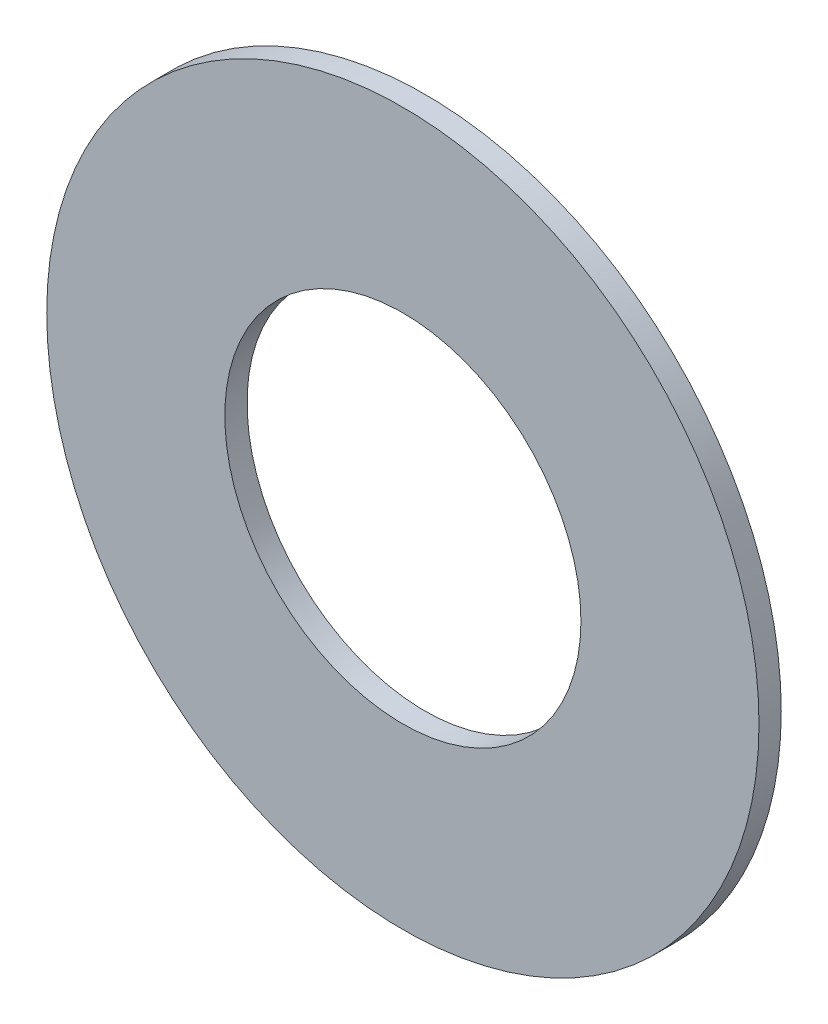
ISO-10303-21;
HEADER;
FILE_DESCRIPTION(('STEP AP214'),'2;1');
FILE_NAME('part.step','',(''),(''),'','','');
FILE_SCHEMA(('AUTOMOTIVE_DESIGN { 1 0 10303 214 1 1 1 1 }'));
ENDSEC;
DATA;
#1=APPLICATION_CONTEXT('core data for automotive mechanical design processes');
#2=APPLICATION_PROTOCOL_DEFINITION('international standard','automotive_design',2000,#1);
#3=PRODUCT_CONTEXT('',#1,'mechanical');
#4=PRODUCT('Part','Part','',(#3));
#5=PRODUCT_RELATED_PRODUCT_CATEGORY('part','',(#4));
#6=PRODUCT_DEFINITION_FORMATION('','',#4);
#7=PRODUCT_DEFINITION_CONTEXT('part definition',#1,'design');
#8=PRODUCT_DEFINITION('design','',#6,#7);
#9=PRODUCT_DEFINITION_SHAPE('','',#8);
#10=(LENGTH_UNIT() NAMED_UNIT(*) SI_UNIT(.MILLI.,.METRE.));
#11=(NAMED_UNIT(*) PLANE_ANGLE_UNIT() SI_UNIT($,.RADIAN.));
#12=(NAMED_UNIT(*) SI_UNIT($,.STERADIAN.) SOLID_ANGLE_UNIT());
#13=UNCERTAINTY_MEASURE_WITH_UNIT(LENGTH_MEASURE(1.E-05),#10,'distance_accuracy_value','');
#14=(GEOMETRIC_REPRESENTATION_CONTEXT(3) GLOBAL_UNCERTAINTY_ASSIGNED_CONTEXT((#13)) GLOBAL_UNIT_ASSIGNED_CONTEXT((#10,
#11,#12)) REPRESENTATION_CONTEXT('',''));
#15=CARTESIAN_POINT('',(0.,0.,0.));
#16=DIRECTION('',(0.,0.,1.));
#17=DIRECTION('',(1.,0.,0.));
#18=AXIS2_PLACEMENT_3D('',#15,#16,#17);
#19=CARTESIAN_POINT('',(0.,0.,0.5));
#20=DIRECTION('',(0.,0.,1.));
#21=DIRECTION('',(1.,0.,0.));
#22=AXIS2_PLACEMENT_3D('',#19,#20,#21);
#23=PLANE('',#22);
#24=CARTESIAN_POINT('',(0.,0.,0.5));
#25=DIRECTION('',(0.,0.,1.));
#26=DIRECTION('',(1.,0.,0.));
#27=AXIS2_PLACEMENT_3D('',#24,#25,#26);
#28=CIRCLE('',#27,8.);
#29=CARTESIAN_POINT('',(8.,0.,0.5));
#30=VERTEX_POINT('',#29);
#31=EDGE_CURVE('E10',#30,#30,#28,.T.);
#32=ORIENTED_EDGE('',*,*,#31,.T.);
#33=EDGE_LOOP('',(#32));
#34=FACE_BOUND('',#33,.T.);
#35=CARTESIAN_POINT('',(0.,0.,0.5));
#36=DIRECTION('',(0.,0.,1.));
#37=DIRECTION('',(1.,0.,0.));
#38=AXIS2_PLACEMENT_3D('',#35,#36,#37);
#39=CIRCLE('',#38,4.);
#40=CARTESIAN_POINT('',(4.,0.,0.5));
#41=VERTEX_POINT('',#40);
#42=EDGE_CURVE('E54',#41,#41,#39,.T.);
#43=ORIENTED_EDGE('',*,*,#42,.F.);
#44=EDGE_LOOP('',(#43));
#45=FACE_BOUND('',#44,.T.);
#46=ADVANCED_FACE('F41',(#34,#45),#23,.T.);
#47=CARTESIAN_POINT('',(0.,0.,0.));
#48=DIRECTION('',(0.,0.,1.));
#49=DIRECTION('',(1.,0.,0.));
#50=AXIS2_PLACEMENT_3D('',#47,#48,#49);
#51=PLANE('',#50);
#52=CARTESIAN_POINT('',(0.,0.,0.));
#53=DIRECTION('',(0.,0.,1.));
#54=DIRECTION('',(1.,0.,0.));
#55=AXIS2_PLACEMENT_3D('',#52,#53,#54);
#56=CIRCLE('',#55,8.);
#57=CARTESIAN_POINT('',(8.,0.,0.));
#58=VERTEX_POINT('',#57);
#59=EDGE_CURVE('E45',#58,#58,#56,.T.);
#60=ORIENTED_EDGE('',*,*,#59,.F.);
#61=EDGE_LOOP('',(#60));
#62=FACE_BOUND('',#61,.T.);
#63=CARTESIAN_POINT('',(0.,0.,0.));
#64=DIRECTION('',(0.,0.,1.));
#65=DIRECTION('',(1.,0.,0.));
#66=AXIS2_PLACEMENT_3D('',#63,#64,#65);
#67=CIRCLE('',#66,4.);
#68=CARTESIAN_POINT('',(4.,0.,0.));
#69=VERTEX_POINT('',#68);
#70=EDGE_CURVE('E56',#69,#69,#67,.T.);
#71=ORIENTED_EDGE('',*,*,#70,.T.);
#72=EDGE_LOOP('',(#71));
#73=FACE_BOUND('',#72,.T.);
#74=ADVANCED_FACE('F68',(#62,#73),#51,.F.);
#75=CARTESIAN_POINT('',(0.,0.,0.5));
#76=DIRECTION('',(0.,0.,-1.));
#77=DIRECTION('',(-1.,0.,0.));
#78=AXIS2_PLACEMENT_3D('',#75,#76,#77);
#79=CYLINDRICAL_SURFACE('',#78,8.);
#80=ORIENTED_EDGE('',*,*,#31,.F.);
#81=EDGE_LOOP('',(#80));
#82=FACE_BOUND('',#81,.T.);
#83=ORIENTED_EDGE('',*,*,#59,.T.);
#84=EDGE_LOOP('',(#83));
#85=FACE_BOUND('',#84,.T.);
#86=ADVANCED_FACE('F43',(#82,#85),#79,.T.);
#87=CARTESIAN_POINT('',(0.,0.,0.5));
#88=DIRECTION('',(0.,0.,-1.));
#89=DIRECTION('',(-1.,0.,0.));
#90=AXIS2_PLACEMENT_3D('',#87,#88,#89);
#91=CYLINDRICAL_SURFACE('',#90,4.);
#92=ORIENTED_EDGE('',*,*,#42,.T.);
#93=EDGE_LOOP('',(#92));
#94=FACE_BOUND('',#93,.T.);
#95=ORIENTED_EDGE('',*,*,#70,.F.);
#96=EDGE_LOOP('',(#95));
#97=FACE_BOUND('',#96,.T.);
#98=ADVANCED_FACE('F64',(#94,#97),#91,.F.);
#99=CLOSED_SHELL('',(#46,#74,#86,#98));
#100=MANIFOLD_SOLID_BREP('B2',#99);
#101=ADVANCED_BREP_SHAPE_REPRESENTATION('',(#18,#100),#14);
#102=SHAPE_DEFINITION_REPRESENTATION(#9,#101);
ENDSEC;
END-ISO-10303-21;
